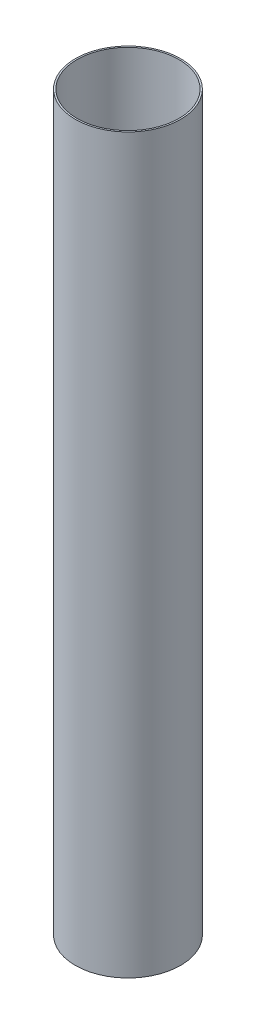
ISO-10303-21;
HEADER;
FILE_DESCRIPTION(('STEP AP214'),'2;1');
FILE_NAME('part.step','',(''),(''),'','','');
FILE_SCHEMA(('AUTOMOTIVE_DESIGN { 1 0 10303 214 1 1 1 1 }'));
ENDSEC;
DATA;
#1=APPLICATION_CONTEXT('core data for automotive mechanical design processes');
#2=APPLICATION_PROTOCOL_DEFINITION('international standard','automotive_design',2000,#1);
#3=PRODUCT_CONTEXT('',#1,'mechanical');
#4=PRODUCT('Part','Part','',(#3));
#5=PRODUCT_RELATED_PRODUCT_CATEGORY('part','',(#4));
#6=PRODUCT_DEFINITION_FORMATION('','',#4);
#7=PRODUCT_DEFINITION_CONTEXT('part definition',#1,'design');
#8=PRODUCT_DEFINITION('design','',#6,#7);
#9=PRODUCT_DEFINITION_SHAPE('','',#8);
#10=(LENGTH_UNIT() NAMED_UNIT(*) SI_UNIT(.MILLI.,.METRE.));
#11=(NAMED_UNIT(*) PLANE_ANGLE_UNIT() SI_UNIT($,.RADIAN.));
#12=(NAMED_UNIT(*) SI_UNIT($,.STERADIAN.) SOLID_ANGLE_UNIT());
#13=UNCERTAINTY_MEASURE_WITH_UNIT(LENGTH_MEASURE(1.E-05),#10,'distance_accuracy_value','');
#14=(GEOMETRIC_REPRESENTATION_CONTEXT(3) GLOBAL_UNCERTAINTY_ASSIGNED_CONTEXT((#13)) GLOBAL_UNIT_ASSIGNED_CONTEXT((#10,
#11,#12)) REPRESENTATION_CONTEXT('',''));
#15=CARTESIAN_POINT('',(0.,0.,0.));
#16=DIRECTION('',(0.,0.,1.));
#17=DIRECTION('',(1.,0.,0.));
#18=AXIS2_PLACEMENT_3D('',#15,#16,#17);
#19=CARTESIAN_POINT('',(0.,711.2,0.));
#20=DIRECTION('',(0.,1.,0.));
#21=DIRECTION('',(0.,0.,1.));
#22=AXIS2_PLACEMENT_3D('',#19,#20,#21);
#23=PLANE('',#22);
#24=CARTESIAN_POINT('',(0.,711.2,0.));
#25=DIRECTION('',(0.,1.,0.));
#26=DIRECTION('',(0.,0.,1.));
#27=AXIS2_PLACEMENT_3D('',#24,#25,#26);
#28=CIRCLE('',#27,51.1048);
#29=CARTESIAN_POINT('',(0.,711.2,51.1048));
#30=VERTEX_POINT('',#29);
#31=EDGE_CURVE('E10',#30,#30,#28,.T.);
#32=ORIENTED_EDGE('',*,*,#31,.T.);
#33=EDGE_LOOP('',(#32));
#34=FACE_BOUND('',#33,.T.);
#35=CARTESIAN_POINT('',(0.,711.2,0.));
#36=DIRECTION('',(0.,1.,0.));
#37=DIRECTION('',(0.,0.,1.));
#38=AXIS2_PLACEMENT_3D('',#35,#36,#37);
#39=CIRCLE('',#38,49.53);
#40=CARTESIAN_POINT('',(0.,711.2,49.53));
#41=VERTEX_POINT('',#40);
#42=EDGE_CURVE('E56',#41,#41,#39,.T.);
#43=ORIENTED_EDGE('',*,*,#42,.F.);
#44=EDGE_LOOP('',(#43));
#45=FACE_BOUND('',#44,.T.);
#46=ADVANCED_FACE('F43',(#34,#45),#23,.T.);
#47=CARTESIAN_POINT('',(0.,0.,0.));
#48=DIRECTION('',(0.,1.,0.));
#49=DIRECTION('',(0.,0.,1.));
#50=AXIS2_PLACEMENT_3D('',#47,#48,#49);
#51=PLANE('',#50);
#52=CARTESIAN_POINT('',(0.,0.,0.));
#53=DIRECTION('',(0.,1.,0.));
#54=DIRECTION('',(0.,0.,1.));
#55=AXIS2_PLACEMENT_3D('',#52,#53,#54);
#56=CIRCLE('',#55,51.1048);
#57=CARTESIAN_POINT('',(0.,0.,51.1048));
#58=VERTEX_POINT('',#57);
#59=EDGE_CURVE('E47',#58,#58,#56,.T.);
#60=ORIENTED_EDGE('',*,*,#59,.F.);
#61=EDGE_LOOP('',(#60));
#62=FACE_BOUND('',#61,.T.);
#63=CARTESIAN_POINT('',(0.,0.,0.));
#64=DIRECTION('',(0.,1.,0.));
#65=DIRECTION('',(0.,0.,1.));
#66=AXIS2_PLACEMENT_3D('',#63,#64,#65);
#67=CIRCLE('',#66,49.53);
#68=CARTESIAN_POINT('',(0.,0.,49.53));
#69=VERTEX_POINT('',#68);
#70=EDGE_CURVE('E58',#69,#69,#67,.T.);
#71=ORIENTED_EDGE('',*,*,#70,.T.);
#72=EDGE_LOOP('',(#71));
#73=FACE_BOUND('',#72,.T.);
#74=ADVANCED_FACE('F70',(#62,#73),#51,.F.);
#75=CARTESIAN_POINT('',(0.,711.2,0.));
#76=DIRECTION('',(0.,-1.,0.));
#77=DIRECTION('',(0.,0.,-1.));
#78=AXIS2_PLACEMENT_3D('',#75,#76,#77);
#79=CYLINDRICAL_SURFACE('',#78,51.1048);
#80=ORIENTED_EDGE('',*,*,#31,.F.);
#81=EDGE_LOOP('',(#80));
#82=FACE_BOUND('',#81,.T.);
#83=ORIENTED_EDGE('',*,*,#59,.T.);
#84=EDGE_LOOP('',(#83));
#85=FACE_BOUND('',#84,.T.);
#86=ADVANCED_FACE('F45',(#82,#85),#79,.T.);
#87=CARTESIAN_POINT('',(0.,711.2,0.));
#88=DIRECTION('',(0.,-1.,0.));
#89=DIRECTION('',(0.,0.,-1.));
#90=AXIS2_PLACEMENT_3D('',#87,#88,#89);
#91=CYLINDRICAL_SURFACE('',#90,49.53);
#92=ORIENTED_EDGE('',*,*,#42,.T.);
#93=EDGE_LOOP('',(#92));
#94=FACE_BOUND('',#93,.T.);
#95=ORIENTED_EDGE('',*,*,#70,.F.);
#96=EDGE_LOOP('',(#95));
#97=FACE_BOUND('',#96,.T.);
#98=ADVANCED_FACE('F66',(#94,#97),#91,.F.);
#99=CLOSED_SHELL('',(#46,#74,#86,#98));
#100=MANIFOLD_SOLID_BREP('B2',#99);
#101=ADVANCED_BREP_SHAPE_REPRESENTATION('',(#18,#100),#14);
#102=SHAPE_DEFINITION_REPRESENTATION(#9,#101);
ENDSEC;
END-ISO-10303-21;
